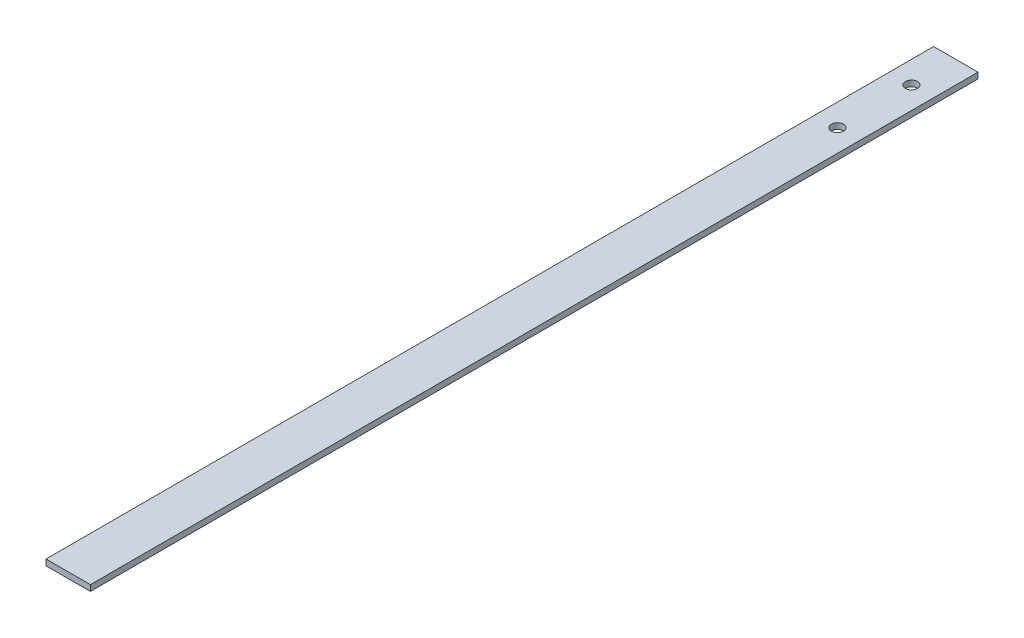
ISO-10303-21;
HEADER;
FILE_DESCRIPTION(('STEP AP214'),'2;1');
FILE_NAME('part.step','',(''),(''),'','','');
FILE_SCHEMA(('AUTOMOTIVE_DESIGN { 1 0 10303 214 1 1 1 1 }'));
ENDSEC;
DATA;
#1=APPLICATION_CONTEXT('core data for automotive mechanical design processes');
#2=APPLICATION_PROTOCOL_DEFINITION('international standard','automotive_design',2000,#1);
#3=PRODUCT_CONTEXT('',#1,'mechanical');
#4=PRODUCT('Part','Part','',(#3));
#5=PRODUCT_RELATED_PRODUCT_CATEGORY('part','',(#4));
#6=PRODUCT_DEFINITION_FORMATION('','',#4);
#7=PRODUCT_DEFINITION_CONTEXT('part definition',#1,'design');
#8=PRODUCT_DEFINITION('design','',#6,#7);
#9=PRODUCT_DEFINITION_SHAPE('','',#8);
#10=(LENGTH_UNIT() NAMED_UNIT(*) SI_UNIT(.MILLI.,.METRE.));
#11=(NAMED_UNIT(*) PLANE_ANGLE_UNIT() SI_UNIT($,.RADIAN.));
#12=(NAMED_UNIT(*) SI_UNIT($,.STERADIAN.) SOLID_ANGLE_UNIT());
#13=UNCERTAINTY_MEASURE_WITH_UNIT(LENGTH_MEASURE(1.E-05),#10,'distance_accuracy_value','');
#14=(GEOMETRIC_REPRESENTATION_CONTEXT(3) GLOBAL_UNCERTAINTY_ASSIGNED_CONTEXT((#13)) GLOBAL_UNIT_ASSIGNED_CONTEXT((#10,
#11,#12)) REPRESENTATION_CONTEXT('',''));
#15=CARTESIAN_POINT('',(0.,0.,0.));
#16=DIRECTION('',(0.,0.,1.));
#17=DIRECTION('',(1.,0.,0.));
#18=AXIS2_PLACEMENT_3D('',#15,#16,#17);
#19=CARTESIAN_POINT('',(0.,0.,300.));
#20=DIRECTION('',(1.,0.,0.));
#21=DIRECTION('',(0.,0.,-1.));
#22=AXIS2_PLACEMENT_3D('',#19,#20,#21);
#23=PLANE('',#22);
#24=DIRECTION('',(0.,-1.,0.));
#25=VECTOR('',#24,1.);
#26=CARTESIAN_POINT('',(0.,0.,0.));
#27=LINE('',#26,#25);
#28=CARTESIAN_POINT('',(0.,2.,0.));
#29=VERTEX_POINT('',#28);
#30=CARTESIAN_POINT('',(0.,0.,0.));
#31=VERTEX_POINT('',#30);
#32=EDGE_CURVE('E110',#29,#31,#27,.T.);
#33=ORIENTED_EDGE('',*,*,#32,.T.);
#34=DIRECTION('',(0.,0.,-1.));
#35=VECTOR('',#34,1.);
#36=CARTESIAN_POINT('',(0.,0.,300.));
#37=LINE('',#36,#35);
#38=CARTESIAN_POINT('',(0.,0.,300.));
#39=VERTEX_POINT('',#38);
#40=EDGE_CURVE('E11',#39,#31,#37,.T.);
#41=ORIENTED_EDGE('',*,*,#40,.F.);
#42=DIRECTION('',(0.,-1.,0.));
#43=VECTOR('',#42,1.);
#44=CARTESIAN_POINT('',(0.,0.,300.));
#45=LINE('',#44,#43);
#46=CARTESIAN_POINT('',(0.,2.,300.));
#47=VERTEX_POINT('',#46);
#48=EDGE_CURVE('E93',#47,#39,#45,.T.);
#49=ORIENTED_EDGE('',*,*,#48,.F.);
#50=DIRECTION('',(0.,0.,-1.));
#51=VECTOR('',#50,1.);
#52=CARTESIAN_POINT('',(0.,2.,300.));
#53=LINE('',#52,#51);
#54=EDGE_CURVE('E106',#47,#29,#53,.T.);
#55=ORIENTED_EDGE('',*,*,#54,.T.);
#56=EDGE_LOOP('',(#33,#41,#49,#55));
#57=FACE_BOUND('',#56,.T.);
#58=ADVANCED_FACE('F41',(#57),#23,.F.);
#59=CARTESIAN_POINT('',(0.,0.,300.));
#60=DIRECTION('',(0.,1.,0.));
#61=DIRECTION('',(0.,0.,1.));
#62=AXIS2_PLACEMENT_3D('',#59,#60,#61);
#63=PLANE('',#62);
#64=CARTESIAN_POINT('',(7.5,0.,15.));
#65=DIRECTION('',(0.,1.,0.));
#66=DIRECTION('',(0.,0.,1.));
#67=AXIS2_PLACEMENT_3D('',#64,#65,#66);
#68=CIRCLE('',#67,2.05);
#69=CARTESIAN_POINT('',(7.5,0.,17.05));
#70=VERTEX_POINT('',#69);
#71=EDGE_CURVE('E114',#70,#70,#68,.T.);
#72=ORIENTED_EDGE('',*,*,#71,.T.);
#73=EDGE_LOOP('',(#72));
#74=FACE_BOUND('',#73,.T.);
#75=CARTESIAN_POINT('',(7.5,0.,40.));
#76=DIRECTION('',(0.,1.,0.));
#77=DIRECTION('',(0.,0.,1.));
#78=AXIS2_PLACEMENT_3D('',#75,#76,#77);
#79=CIRCLE('',#78,2.05);
#80=CARTESIAN_POINT('',(7.5,0.,42.05));
#81=VERTEX_POINT('',#80);
#82=EDGE_CURVE('E137',#81,#81,#79,.T.);
#83=ORIENTED_EDGE('',*,*,#82,.T.);
#84=EDGE_LOOP('',(#83));
#85=FACE_BOUND('',#84,.T.);
#86=DIRECTION('',(1.,0.,0.));
#87=VECTOR('',#86,1.);
#88=CARTESIAN_POINT('',(0.,0.,0.));
#89=LINE('',#88,#87);
#90=CARTESIAN_POINT('',(15.,0.,0.));
#91=VERTEX_POINT('',#90);
#92=EDGE_CURVE('E98',#31,#91,#89,.T.);
#93=ORIENTED_EDGE('',*,*,#92,.T.);
#94=DIRECTION('',(0.,0.,-1.));
#95=VECTOR('',#94,1.);
#96=CARTESIAN_POINT('',(15.,0.,300.));
#97=LINE('',#96,#95);
#98=CARTESIAN_POINT('',(15.,0.,300.));
#99=VERTEX_POINT('',#98);
#100=EDGE_CURVE('E50',#99,#91,#97,.T.);
#101=ORIENTED_EDGE('',*,*,#100,.F.);
#102=DIRECTION('',(1.,0.,0.));
#103=VECTOR('',#102,1.);
#104=CARTESIAN_POINT('',(0.,0.,300.));
#105=LINE('',#104,#103);
#106=EDGE_CURVE('E88',#39,#99,#105,.T.);
#107=ORIENTED_EDGE('',*,*,#106,.F.);
#108=ORIENTED_EDGE('',*,*,#40,.T.);
#109=EDGE_LOOP('',(#93,#101,#107,#108));
#110=FACE_BOUND('',#109,.T.);
#111=ADVANCED_FACE('F97',(#74,#85,#110),#63,.F.);
#112=CARTESIAN_POINT('',(15.,0.,300.));
#113=DIRECTION('',(-1.,0.,0.));
#114=DIRECTION('',(0.,0.,1.));
#115=AXIS2_PLACEMENT_3D('',#112,#113,#114);
#116=PLANE('',#115);
#117=DIRECTION('',(0.,1.,0.));
#118=VECTOR('',#117,1.);
#119=CARTESIAN_POINT('',(15.,0.,0.));
#120=LINE('',#119,#118);
#121=CARTESIAN_POINT('',(15.,2.,0.));
#122=VERTEX_POINT('',#121);
#123=EDGE_CURVE('E75',#91,#122,#120,.T.);
#124=ORIENTED_EDGE('',*,*,#123,.T.);
#125=DIRECTION('',(0.,0.,-1.));
#126=VECTOR('',#125,1.);
#127=CARTESIAN_POINT('',(15.,2.,300.));
#128=LINE('',#127,#126);
#129=CARTESIAN_POINT('',(15.,2.,300.));
#130=VERTEX_POINT('',#129);
#131=EDGE_CURVE('E100',#130,#122,#128,.T.);
#132=ORIENTED_EDGE('',*,*,#131,.F.);
#133=DIRECTION('',(0.,1.,0.));
#134=VECTOR('',#133,1.);
#135=CARTESIAN_POINT('',(15.,0.,300.));
#136=LINE('',#135,#134);
#137=EDGE_CURVE('E91',#99,#130,#136,.T.);
#138=ORIENTED_EDGE('',*,*,#137,.F.);
#139=ORIENTED_EDGE('',*,*,#100,.T.);
#140=EDGE_LOOP('',(#124,#132,#138,#139));
#141=FACE_BOUND('',#140,.T.);
#142=ADVANCED_FACE('F101',(#141),#116,.F.);
#143=CARTESIAN_POINT('',(0.,2.,300.));
#144=DIRECTION('',(0.,-1.,0.));
#145=DIRECTION('',(0.,0.,-1.));
#146=AXIS2_PLACEMENT_3D('',#143,#144,#145);
#147=PLANE('',#146);
#148=CARTESIAN_POINT('',(7.5,2.,15.));
#149=DIRECTION('',(0.,1.,0.));
#150=DIRECTION('',(0.,0.,1.));
#151=AXIS2_PLACEMENT_3D('',#148,#149,#150);
#152=CIRCLE('',#151,2.05);
#153=CARTESIAN_POINT('',(7.5,2.,17.05));
#154=VERTEX_POINT('',#153);
#155=EDGE_CURVE('E141',#154,#154,#152,.T.);
#156=ORIENTED_EDGE('',*,*,#155,.F.);
#157=EDGE_LOOP('',(#156));
#158=FACE_BOUND('',#157,.T.);
#159=CARTESIAN_POINT('',(7.5,2.,40.));
#160=DIRECTION('',(0.,1.,0.));
#161=DIRECTION('',(0.,0.,1.));
#162=AXIS2_PLACEMENT_3D('',#159,#160,#161);
#163=CIRCLE('',#162,2.05);
#164=CARTESIAN_POINT('',(7.5,2.,42.05));
#165=VERTEX_POINT('',#164);
#166=EDGE_CURVE('E133',#165,#165,#163,.T.);
#167=ORIENTED_EDGE('',*,*,#166,.F.);
#168=EDGE_LOOP('',(#167));
#169=FACE_BOUND('',#168,.T.);
#170=DIRECTION('',(-1.,0.,0.));
#171=VECTOR('',#170,1.);
#172=CARTESIAN_POINT('',(0.,2.,0.));
#173=LINE('',#172,#171);
#174=EDGE_CURVE('E81',#122,#29,#173,.T.);
#175=ORIENTED_EDGE('',*,*,#174,.T.);
#176=ORIENTED_EDGE('',*,*,#54,.F.);
#177=DIRECTION('',(-1.,0.,0.));
#178=VECTOR('',#177,1.);
#179=CARTESIAN_POINT('',(0.,2.,300.));
#180=LINE('',#179,#178);
#181=EDGE_CURVE('E58',#130,#47,#180,.T.);
#182=ORIENTED_EDGE('',*,*,#181,.F.);
#183=ORIENTED_EDGE('',*,*,#131,.T.);
#184=EDGE_LOOP('',(#175,#176,#182,#183));
#185=FACE_BOUND('',#184,.T.);
#186=ADVANCED_FACE('F125',(#158,#169,#185),#147,.F.);
#187=CARTESIAN_POINT('',(0.,0.,300.));
#188=DIRECTION('',(0.,0.,-1.));
#189=DIRECTION('',(-1.,0.,0.));
#190=AXIS2_PLACEMENT_3D('',#187,#188,#189);
#191=PLANE('',#190);
#192=ORIENTED_EDGE('',*,*,#48,.T.);
#193=ORIENTED_EDGE('',*,*,#106,.T.);
#194=ORIENTED_EDGE('',*,*,#137,.T.);
#195=ORIENTED_EDGE('',*,*,#181,.T.);
#196=EDGE_LOOP('',(#192,#193,#194,#195));
#197=FACE_BOUND('',#196,.T.);
#198=ADVANCED_FACE('F89',(#197),#191,.F.);
#199=CARTESIAN_POINT('',(0.,0.,0.));
#200=DIRECTION('',(0.,0.,-1.));
#201=DIRECTION('',(-1.,0.,0.));
#202=AXIS2_PLACEMENT_3D('',#199,#200,#201);
#203=PLANE('',#202);
#204=ORIENTED_EDGE('',*,*,#32,.F.);
#205=ORIENTED_EDGE('',*,*,#174,.F.);
#206=ORIENTED_EDGE('',*,*,#123,.F.);
#207=ORIENTED_EDGE('',*,*,#92,.F.);
#208=EDGE_LOOP('',(#204,#205,#206,#207));
#209=FACE_BOUND('',#208,.T.);
#210=ADVANCED_FACE('F128',(#209),#203,.T.);
#211=CARTESIAN_POINT('',(7.5,0.,40.));
#212=DIRECTION('',(0.,1.,0.));
#213=DIRECTION('',(0.,0.,1.));
#214=AXIS2_PLACEMENT_3D('',#211,#212,#213);
#215=CYLINDRICAL_SURFACE('',#214,2.05);
#216=ORIENTED_EDGE('',*,*,#82,.F.);
#217=EDGE_LOOP('',(#216));
#218=FACE_BOUND('',#217,.T.);
#219=ORIENTED_EDGE('',*,*,#166,.T.);
#220=EDGE_LOOP('',(#219));
#221=FACE_BOUND('',#220,.T.);
#222=ADVANCED_FACE('F155',(#218,#221),#215,.F.);
#223=CARTESIAN_POINT('',(7.5,0.,15.));
#224=DIRECTION('',(0.,1.,0.));
#225=DIRECTION('',(0.,0.,1.));
#226=AXIS2_PLACEMENT_3D('',#223,#224,#225);
#227=CYLINDRICAL_SURFACE('',#226,2.05);
#228=ORIENTED_EDGE('',*,*,#71,.F.);
#229=EDGE_LOOP('',(#228));
#230=FACE_BOUND('',#229,.T.);
#231=ORIENTED_EDGE('',*,*,#155,.T.);
#232=EDGE_LOOP('',(#231));
#233=FACE_BOUND('',#232,.T.);
#234=ADVANCED_FACE('F152',(#230,#233),#227,.F.);
#235=CLOSED_SHELL('',(#58,#111,#142,#186,#198,#210,#222,#234));
#236=MANIFOLD_SOLID_BREP('B2',#235);
#237=ADVANCED_BREP_SHAPE_REPRESENTATION('',(#18,#236),#14);
#238=SHAPE_DEFINITION_REPRESENTATION(#9,#237);
ENDSEC;
END-ISO-10303-21;
